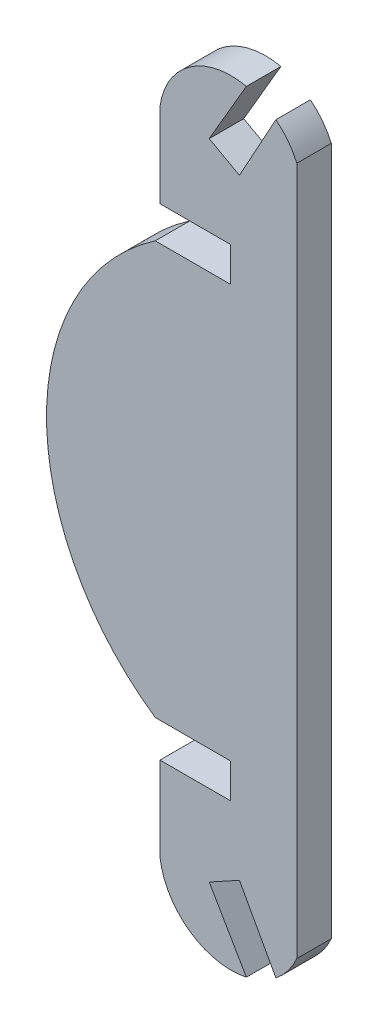
ISO-10303-21;
HEADER;
FILE_DESCRIPTION(('STEP AP214'),'2;1');
FILE_NAME('part.step','',(''),(''),'','','');
FILE_SCHEMA(('AUTOMOTIVE_DESIGN { 1 0 10303 214 1 1 1 1 }'));
ENDSEC;
DATA;
#1=APPLICATION_CONTEXT('core data for automotive mechanical design processes');
#2=APPLICATION_PROTOCOL_DEFINITION('international standard','automotive_design',2000,#1);
#3=PRODUCT_CONTEXT('',#1,'mechanical');
#4=PRODUCT('Part','Part','',(#3));
#5=PRODUCT_RELATED_PRODUCT_CATEGORY('part','',(#4));
#6=PRODUCT_DEFINITION_FORMATION('','',#4);
#7=PRODUCT_DEFINITION_CONTEXT('part definition',#1,'design');
#8=PRODUCT_DEFINITION('design','',#6,#7);
#9=PRODUCT_DEFINITION_SHAPE('','',#8);
#10=(LENGTH_UNIT() NAMED_UNIT(*) SI_UNIT(.MILLI.,.METRE.));
#11=(NAMED_UNIT(*) PLANE_ANGLE_UNIT() SI_UNIT($,.RADIAN.));
#12=(NAMED_UNIT(*) SI_UNIT($,.STERADIAN.) SOLID_ANGLE_UNIT());
#13=UNCERTAINTY_MEASURE_WITH_UNIT(LENGTH_MEASURE(1.E-05),#10,'distance_accuracy_value','');
#14=(GEOMETRIC_REPRESENTATION_CONTEXT(3) GLOBAL_UNCERTAINTY_ASSIGNED_CONTEXT((#13)) GLOBAL_UNIT_ASSIGNED_CONTEXT((#10,
#11,#12)) REPRESENTATION_CONTEXT('',''));
#15=CARTESIAN_POINT('',(0.,0.,0.));
#16=DIRECTION('',(0.,0.,1.));
#17=DIRECTION('',(1.,0.,0.));
#18=AXIS2_PLACEMENT_3D('',#15,#16,#17);
#19=CARTESIAN_POINT('',(194.442192630334,-119.572174415967,3.));
#20=DIRECTION('',(0.,0.,-1.));
#21=DIRECTION('',(-1.,0.,0.));
#22=AXIS2_PLACEMENT_3D('',#19,#20,#21);
#23=CYLINDRICAL_SURFACE('',#22,6.2400697461453);
#24=CARTESIAN_POINT('',(194.442192630334,-119.572174415967,0.));
#25=DIRECTION('',(0.,0.,1.));
#26=DIRECTION('',(-1.,0.,0.));
#27=AXIS2_PLACEMENT_3D('',#24,#25,#26);
#28=CIRCLE('',#27,6.2400697461453);
#29=CARTESIAN_POINT('',(198.339039248071,-124.445885206996,0.));
#30=VERTEX_POINT('',#29);
#31=CARTESIAN_POINT('',(200.158445725479,-122.07475727953,0.));
#32=VERTEX_POINT('',#31);
#33=EDGE_CURVE('E202',#30,#32,#28,.T.);
#34=ORIENTED_EDGE('',*,*,#33,.T.);
#35=DIRECTION('',(0.,0.,-1.));
#36=VECTOR('',#35,1.);
#37=CARTESIAN_POINT('',(200.158445725479,-122.07475727953,3.));
#38=LINE('',#37,#36);
#39=CARTESIAN_POINT('',(200.158445725479,-122.07475727953,3.));
#40=VERTEX_POINT('',#39);
#41=EDGE_CURVE('E11',#40,#32,#38,.T.);
#42=ORIENTED_EDGE('',*,*,#41,.F.);
#43=CARTESIAN_POINT('',(194.442192630334,-119.572174415967,3.));
#44=DIRECTION('',(0.,0.,1.));
#45=DIRECTION('',(-1.,0.,0.));
#46=AXIS2_PLACEMENT_3D('',#43,#44,#45);
#47=CIRCLE('',#46,6.2400697461453);
#48=CARTESIAN_POINT('',(198.339039248071,-124.445885206996,3.));
#49=VERTEX_POINT('',#48);
#50=EDGE_CURVE('E240',#49,#40,#47,.T.);
#51=ORIENTED_EDGE('',*,*,#50,.F.);
#52=DIRECTION('',(0.,0.,-1.));
#53=VECTOR('',#52,1.);
#54=CARTESIAN_POINT('',(198.339039248071,-124.445885206996,3.));
#55=LINE('',#54,#53);
#56=EDGE_CURVE('E198',#49,#30,#55,.T.);
#57=ORIENTED_EDGE('',*,*,#56,.T.);
#58=EDGE_LOOP('',(#34,#42,#51,#57));
#59=FACE_BOUND('',#58,.T.);
#60=ADVANCED_FACE('F34',(#59),#23,.T.);
#61=CARTESIAN_POINT('',(200.158445725479,-122.07475727953,3.));
#62=DIRECTION('',(-1.,0.,0.));
#63=DIRECTION('',(0.,0.,1.));
#64=AXIS2_PLACEMENT_3D('',#61,#62,#63);
#65=PLANE('',#64);
#66=DIRECTION('',(0.,1.,0.));
#67=VECTOR('',#66,1.);
#68=CARTESIAN_POINT('',(200.158445725479,-122.07475727953,0.));
#69=LINE('',#68,#67);
#70=CARTESIAN_POINT('',(200.158445725479,-62.1705737777062,0.));
#71=VERTEX_POINT('',#70);
#72=EDGE_CURVE('E205',#32,#71,#69,.T.);
#73=ORIENTED_EDGE('',*,*,#72,.T.);
#74=DIRECTION('',(0.,0.,-1.));
#75=VECTOR('',#74,1.);
#76=CARTESIAN_POINT('',(200.158445725479,-62.1705737777062,3.));
#77=LINE('',#76,#75);
#78=CARTESIAN_POINT('',(200.158445725479,-62.1705737777062,3.));
#79=VERTEX_POINT('',#78);
#80=EDGE_CURVE('E42',#79,#71,#77,.T.);
#81=ORIENTED_EDGE('',*,*,#80,.F.);
#82=DIRECTION('',(0.,1.,0.));
#83=VECTOR('',#82,1.);
#84=CARTESIAN_POINT('',(200.158445725479,-122.07475727953,3.));
#85=LINE('',#84,#83);
#86=EDGE_CURVE('E129',#40,#79,#85,.T.);
#87=ORIENTED_EDGE('',*,*,#86,.F.);
#88=ORIENTED_EDGE('',*,*,#41,.T.);
#89=EDGE_LOOP('',(#73,#81,#87,#88));
#90=FACE_BOUND('',#89,.T.);
#91=ADVANCED_FACE('F358',(#90),#65,.F.);
#92=CARTESIAN_POINT('',(194.442192630334,-64.6731566412699,3.));
#93=DIRECTION('',(0.,0.,-1.));
#94=DIRECTION('',(-1.,0.,0.));
#95=AXIS2_PLACEMENT_3D('',#92,#93,#94);
#96=CYLINDRICAL_SURFACE('',#95,6.24006974614529);
#97=CARTESIAN_POINT('',(194.442192630334,-64.6731566412699,0.));
#98=DIRECTION('',(0.,0.,1.));
#99=DIRECTION('',(1.,0.,0.));
#100=AXIS2_PLACEMENT_3D('',#97,#98,#99);
#101=CIRCLE('',#100,6.24006974614529);
#102=CARTESIAN_POINT('',(198.339039248071,-59.7994458502411,0.));
#103=VERTEX_POINT('',#102);
#104=EDGE_CURVE('E207',#71,#103,#101,.T.);
#105=ORIENTED_EDGE('',*,*,#104,.T.);
#106=DIRECTION('',(0.,0.,-1.));
#107=VECTOR('',#106,1.);
#108=CARTESIAN_POINT('',(198.339039248071,-59.7994458502411,3.));
#109=LINE('',#108,#107);
#110=CARTESIAN_POINT('',(198.339039248071,-59.7994458502411,3.));
#111=VERTEX_POINT('',#110);
#112=EDGE_CURVE('E283',#111,#103,#109,.T.);
#113=ORIENTED_EDGE('',*,*,#112,.F.);
#114=CARTESIAN_POINT('',(194.442192630334,-64.6731566412699,3.));
#115=DIRECTION('',(0.,0.,1.));
#116=DIRECTION('',(1.,0.,0.));
#117=AXIS2_PLACEMENT_3D('',#114,#115,#116);
#118=CIRCLE('',#117,6.24006974614529);
#119=EDGE_CURVE('E291',#79,#111,#118,.T.);
#120=ORIENTED_EDGE('',*,*,#119,.F.);
#121=ORIENTED_EDGE('',*,*,#80,.T.);
#122=EDGE_LOOP('',(#105,#113,#120,#121));
#123=FACE_BOUND('',#122,.T.);
#124=ADVANCED_FACE('F289',(#123),#96,.T.);
#125=CARTESIAN_POINT('',(195.167267959211,-65.5726655286183,3.));
#126=DIRECTION('',(0.876440149954587,-0.481510813531308,0.));
#127=DIRECTION('',(0.481510813531308,0.876440149954587,0.));
#128=AXIS2_PLACEMENT_3D('',#125,#126,#127);
#129=PLANE('',#128);
#130=DIRECTION('',(-0.481510813531308,-0.876440149954587,0.));
#131=VECTOR('',#130,1.);
#132=CARTESIAN_POINT('',(195.167267959211,-65.5726655286183,0.));
#133=LINE('',#132,#131);
#134=CARTESIAN_POINT('',(195.167267959211,-65.5726655286183,0.));
#135=VERTEX_POINT('',#134);
#136=EDGE_CURVE('E209',#103,#135,#133,.T.);
#137=ORIENTED_EDGE('',*,*,#136,.T.);
#138=DIRECTION('',(0.,0.,-1.));
#139=VECTOR('',#138,1.);
#140=CARTESIAN_POINT('',(195.167267959211,-65.5726655286183,3.));
#141=LINE('',#140,#139);
#142=CARTESIAN_POINT('',(195.167267959211,-65.5726655286183,3.));
#143=VERTEX_POINT('',#142);
#144=EDGE_CURVE('E280',#143,#135,#141,.T.);
#145=ORIENTED_EDGE('',*,*,#144,.F.);
#146=DIRECTION('',(-0.481510813531308,-0.876440149954587,0.));
#147=VECTOR('',#146,1.);
#148=CARTESIAN_POINT('',(195.167267959211,-65.5726655286183,3.));
#149=LINE('',#148,#147);
#150=EDGE_CURVE('E309',#111,#143,#149,.T.);
#151=ORIENTED_EDGE('',*,*,#150,.F.);
#152=ORIENTED_EDGE('',*,*,#112,.T.);
#153=EDGE_LOOP('',(#137,#145,#151,#152));
#154=FACE_BOUND('',#153,.T.);
#155=ADVANCED_FACE('F300',(#154),#129,.F.);
#156=CARTESIAN_POINT('',(192.537947509347,-64.1281330880244,3.));
#157=DIRECTION('',(-0.481510813531309,-0.876440149954586,0.));
#158=DIRECTION('',(0.876440149954586,-0.481510813531309,0.));
#159=AXIS2_PLACEMENT_3D('',#156,#157,#158);
#160=PLANE('',#159);
#161=DIRECTION('',(-0.876440149954586,0.481510813531309,0.));
#162=VECTOR('',#161,1.);
#163=CARTESIAN_POINT('',(192.537947509347,-64.1281330880244,0.));
#164=LINE('',#163,#162);
#165=CARTESIAN_POINT('',(192.537947509347,-64.1281330880244,0.));
#166=VERTEX_POINT('',#165);
#167=EDGE_CURVE('E211',#135,#166,#164,.T.);
#168=ORIENTED_EDGE('',*,*,#167,.T.);
#169=DIRECTION('',(0.,0.,-1.));
#170=VECTOR('',#169,1.);
#171=CARTESIAN_POINT('',(192.537947509347,-64.1281330880244,3.));
#172=LINE('',#171,#170);
#173=CARTESIAN_POINT('',(192.537947509347,-64.1281330880244,3.));
#174=VERTEX_POINT('',#173);
#175=EDGE_CURVE('E277',#174,#166,#172,.T.);
#176=ORIENTED_EDGE('',*,*,#175,.F.);
#177=DIRECTION('',(-0.876440149954586,0.481510813531309,0.));
#178=VECTOR('',#177,1.);
#179=CARTESIAN_POINT('',(192.537947509347,-64.1281330880244,3.));
#180=LINE('',#179,#178);
#181=EDGE_CURVE('E306',#143,#174,#180,.T.);
#182=ORIENTED_EDGE('',*,*,#181,.F.);
#183=ORIENTED_EDGE('',*,*,#144,.T.);
#184=EDGE_LOOP('',(#168,#176,#182,#183));
#185=FACE_BOUND('',#184,.T.);
#186=ADVANCED_FACE('F304',(#185),#160,.F.);
#187=CARTESIAN_POINT('',(192.537947509347,-64.1281330880244,3.));
#188=DIRECTION('',(-0.864082936072953,0.50334946070056,0.));
#189=DIRECTION('',(-0.50334946070056,-0.864082936072953,0.));
#190=AXIS2_PLACEMENT_3D('',#187,#188,#189);
#191=PLANE('',#190);
#192=DIRECTION('',(0.50334946070056,0.864082936072953,0.));
#193=VECTOR('',#192,1.);
#194=CARTESIAN_POINT('',(192.537947509347,-64.1281330880244,0.));
#195=LINE('',#194,#193);
#196=CARTESIAN_POINT('',(195.771956334189,-58.5764198970216,0.));
#197=VERTEX_POINT('',#196);
#198=EDGE_CURVE('E213',#166,#197,#195,.T.);
#199=ORIENTED_EDGE('',*,*,#198,.T.);
#200=DIRECTION('',(0.,0.,-1.));
#201=VECTOR('',#200,1.);
#202=CARTESIAN_POINT('',(195.771956334189,-58.5764198970216,3.));
#203=LINE('',#202,#201);
#204=CARTESIAN_POINT('',(195.771956334189,-58.5764198970216,3.));
#205=VERTEX_POINT('',#204);
#206=EDGE_CURVE('E274',#205,#197,#203,.T.);
#207=ORIENTED_EDGE('',*,*,#206,.F.);
#208=DIRECTION('',(0.50334946070056,0.864082936072953,0.));
#209=VECTOR('',#208,1.);
#210=CARTESIAN_POINT('',(192.537947509347,-64.1281330880244,3.));
#211=LINE('',#210,#209);
#212=EDGE_CURVE('E308',#174,#205,#211,.T.);
#213=ORIENTED_EDGE('',*,*,#212,.F.);
#214=ORIENTED_EDGE('',*,*,#175,.T.);
#215=EDGE_LOOP('',(#199,#207,#213,#214));
#216=FACE_BOUND('',#215,.T.);
#217=ADVANCED_FACE('F371',(#216),#191,.F.);
#218=CARTESIAN_POINT('',(194.442192630334,-64.6731566412699,3.));
#219=DIRECTION('',(0.,0.,-1.));
#220=DIRECTION('',(-1.,0.,0.));
#221=AXIS2_PLACEMENT_3D('',#218,#219,#220);
#222=CYLINDRICAL_SURFACE('',#221,6.24006974614526);
#223=CARTESIAN_POINT('',(194.442192630334,-64.6731566412699,0.));
#224=DIRECTION('',(0.,0.,1.));
#225=DIRECTION('',(1.,0.,0.));
#226=AXIS2_PLACEMENT_3D('',#223,#224,#225);
#227=CIRCLE('',#226,6.24006974614526);
#228=CARTESIAN_POINT('',(188.258458894633,-63.8365518823165,0.));
#229=VERTEX_POINT('',#228);
#230=EDGE_CURVE('E215',#197,#229,#227,.T.);
#231=ORIENTED_EDGE('',*,*,#230,.T.);
#232=DIRECTION('',(0.,0.,-1.));
#233=VECTOR('',#232,1.);
#234=CARTESIAN_POINT('',(188.258458894633,-63.8365518823165,3.));
#235=LINE('',#234,#233);
#236=CARTESIAN_POINT('',(188.258458894633,-63.8365518823165,3.));
#237=VERTEX_POINT('',#236);
#238=EDGE_CURVE('E271',#237,#229,#235,.T.);
#239=ORIENTED_EDGE('',*,*,#238,.F.);
#240=CARTESIAN_POINT('',(194.442192630334,-64.6731566412699,3.));
#241=DIRECTION('',(0.,0.,1.));
#242=DIRECTION('',(1.,0.,0.));
#243=AXIS2_PLACEMENT_3D('',#240,#241,#242);
#244=CIRCLE('',#243,6.24006974614526);
#245=EDGE_CURVE('E311',#205,#237,#244,.T.);
#246=ORIENTED_EDGE('',*,*,#245,.F.);
#247=ORIENTED_EDGE('',*,*,#206,.T.);
#248=EDGE_LOOP('',(#231,#239,#246,#247));
#249=FACE_BOUND('',#248,.T.);
#250=ADVANCED_FACE('F374',(#249),#222,.T.);
#251=CARTESIAN_POINT('',(188.258458894633,-71.1726655286183,3.));
#252=DIRECTION('',(1.,0.,0.));
#253=DIRECTION('',(0.,1.,0.));
#254=AXIS2_PLACEMENT_3D('',#251,#252,#253);
#255=PLANE('',#254);
#256=DIRECTION('',(0.,-1.,0.));
#257=VECTOR('',#256,1.);
#258=CARTESIAN_POINT('',(188.258458894633,-71.1726655286183,0.));
#259=LINE('',#258,#257);
#260=CARTESIAN_POINT('',(188.258458894633,-71.1726655286183,0.));
#261=VERTEX_POINT('',#260);
#262=EDGE_CURVE('E217',#229,#261,#259,.T.);
#263=ORIENTED_EDGE('',*,*,#262,.T.);
#264=DIRECTION('',(0.,0.,-1.));
#265=VECTOR('',#264,1.);
#266=CARTESIAN_POINT('',(188.258458894633,-71.1726655286183,3.));
#267=LINE('',#266,#265);
#268=CARTESIAN_POINT('',(188.258458894633,-71.1726655286183,3.));
#269=VERTEX_POINT('',#268);
#270=EDGE_CURVE('E268',#269,#261,#267,.T.);
#271=ORIENTED_EDGE('',*,*,#270,.F.);
#272=DIRECTION('',(0.,-1.,0.));
#273=VECTOR('',#272,1.);
#274=CARTESIAN_POINT('',(188.258458894633,-71.1726655286183,3.));
#275=LINE('',#274,#273);
#276=EDGE_CURVE('E317',#237,#269,#275,.T.);
#277=ORIENTED_EDGE('',*,*,#276,.F.);
#278=ORIENTED_EDGE('',*,*,#238,.T.);
#279=EDGE_LOOP('',(#263,#271,#277,#278));
#280=FACE_BOUND('',#279,.T.);
#281=ADVANCED_FACE('F378',(#280),#255,.F.);
#282=CARTESIAN_POINT('',(194.386873078623,-71.1726655286183,3.));
#283=DIRECTION('',(0.,1.,0.));
#284=DIRECTION('',(0.,0.,1.));
#285=AXIS2_PLACEMENT_3D('',#282,#283,#284);
#286=PLANE('',#285);
#287=DIRECTION('',(1.,0.,0.));
#288=VECTOR('',#287,1.);
#289=CARTESIAN_POINT('',(194.386873078623,-71.1726655286183,0.));
#290=LINE('',#289,#288);
#291=CARTESIAN_POINT('',(194.386873078623,-71.1726655286183,0.));
#292=VERTEX_POINT('',#291);
#293=EDGE_CURVE('E219',#261,#292,#290,.T.);
#294=ORIENTED_EDGE('',*,*,#293,.T.);
#295=DIRECTION('',(0.,0.,-1.));
#296=VECTOR('',#295,1.);
#297=CARTESIAN_POINT('',(194.386873078623,-71.1726655286183,3.));
#298=LINE('',#297,#296);
#299=CARTESIAN_POINT('',(194.386873078623,-71.1726655286183,3.));
#300=VERTEX_POINT('',#299);
#301=EDGE_CURVE('E265',#300,#292,#298,.T.);
#302=ORIENTED_EDGE('',*,*,#301,.F.);
#303=DIRECTION('',(1.,0.,0.));
#304=VECTOR('',#303,1.);
#305=CARTESIAN_POINT('',(194.386873078623,-71.1726655286183,3.));
#306=LINE('',#305,#304);
#307=EDGE_CURVE('E319',#269,#300,#306,.T.);
#308=ORIENTED_EDGE('',*,*,#307,.F.);
#309=ORIENTED_EDGE('',*,*,#270,.T.);
#310=EDGE_LOOP('',(#294,#302,#308,#309));
#311=FACE_BOUND('',#310,.T.);
#312=ADVANCED_FACE('F382',(#311),#286,.F.);
#313=CARTESIAN_POINT('',(194.386873078623,-71.1726655286183,3.));
#314=DIRECTION('',(1.,0.,0.));
#315=DIRECTION('',(0.,0.,-1.));
#316=AXIS2_PLACEMENT_3D('',#313,#314,#315);
#317=PLANE('',#316);
#318=DIRECTION('',(0.,-1.,0.));
#319=VECTOR('',#318,1.);
#320=CARTESIAN_POINT('',(194.386873078623,-71.1726655286183,0.));
#321=LINE('',#320,#319);
#322=CARTESIAN_POINT('',(194.386873078623,-74.1726655286183,0.));
#323=VERTEX_POINT('',#322);
#324=EDGE_CURVE('E221',#292,#323,#321,.T.);
#325=ORIENTED_EDGE('',*,*,#324,.T.);
#326=DIRECTION('',(0.,0.,-1.));
#327=VECTOR('',#326,1.);
#328=CARTESIAN_POINT('',(194.386873078623,-74.1726655286183,3.));
#329=LINE('',#328,#327);
#330=CARTESIAN_POINT('',(194.386873078623,-74.1726655286183,3.));
#331=VERTEX_POINT('',#330);
#332=EDGE_CURVE('E262',#331,#323,#329,.T.);
#333=ORIENTED_EDGE('',*,*,#332,.F.);
#334=DIRECTION('',(0.,-1.,0.));
#335=VECTOR('',#334,1.);
#336=CARTESIAN_POINT('',(194.386873078623,-71.1726655286183,3.));
#337=LINE('',#336,#335);
#338=EDGE_CURVE('E321',#300,#331,#337,.T.);
#339=ORIENTED_EDGE('',*,*,#338,.F.);
#340=ORIENTED_EDGE('',*,*,#301,.T.);
#341=EDGE_LOOP('',(#325,#333,#339,#340));
#342=FACE_BOUND('',#341,.T.);
#343=ADVANCED_FACE('F386',(#342),#317,.F.);
#344=CARTESIAN_POINT('',(194.386873078623,-74.1726655286183,3.));
#345=DIRECTION('',(0.,-1.,0.));
#346=DIRECTION('',(0.,0.,-1.));
#347=AXIS2_PLACEMENT_3D('',#344,#345,#346);
#348=PLANE('',#347);
#349=DIRECTION('',(-1.,0.,0.));
#350=VECTOR('',#349,1.);
#351=CARTESIAN_POINT('',(194.386873078623,-74.1726655286183,0.));
#352=LINE('',#351,#350);
#353=CARTESIAN_POINT('',(187.843216204322,-74.1726655286183,0.));
#354=VERTEX_POINT('',#353);
#355=EDGE_CURVE('E223',#323,#354,#352,.T.);
#356=ORIENTED_EDGE('',*,*,#355,.T.);
#357=DIRECTION('',(0.,0.,-1.));
#358=VECTOR('',#357,1.);
#359=CARTESIAN_POINT('',(187.843216204322,-74.1726655286183,3.));
#360=LINE('',#359,#358);
#361=CARTESIAN_POINT('',(187.843216204322,-74.1726655286183,3.));
#362=VERTEX_POINT('',#361);
#363=EDGE_CURVE('E259',#362,#354,#360,.T.);
#364=ORIENTED_EDGE('',*,*,#363,.F.);
#365=DIRECTION('',(-1.,0.,0.));
#366=VECTOR('',#365,1.);
#367=CARTESIAN_POINT('',(194.386873078623,-74.1726655286183,3.));
#368=LINE('',#367,#366);
#369=EDGE_CURVE('E323',#331,#362,#368,.T.);
#370=ORIENTED_EDGE('',*,*,#369,.F.);
#371=ORIENTED_EDGE('',*,*,#332,.T.);
#372=EDGE_LOOP('',(#356,#364,#370,#371));
#373=FACE_BOUND('',#372,.T.);
#374=ADVANCED_FACE('F390',(#373),#348,.F.);
#375=CARTESIAN_POINT('',(200.158445725479,-92.1226655286183,3.));
#376=DIRECTION('',(0.,0.,-1.));
#377=DIRECTION('',(-1.,0.,0.));
#378=AXIS2_PLACEMENT_3D('',#375,#376,#377);
#379=CYLINDRICAL_SURFACE('',#378,21.7684950825447);
#380=CARTESIAN_POINT('',(200.158445725479,-92.1226655286183,0.));
#381=DIRECTION('',(0.,0.,1.));
#382=DIRECTION('',(1.,0.,0.));
#383=AXIS2_PLACEMENT_3D('',#380,#381,#382);
#384=CIRCLE('',#383,21.7684950825447);
#385=CARTESIAN_POINT('',(187.843216204322,-110.072665528618,0.));
#386=VERTEX_POINT('',#385);
#387=EDGE_CURVE('E225',#354,#386,#384,.T.);
#388=ORIENTED_EDGE('',*,*,#387,.T.);
#389=DIRECTION('',(0.,0.,-1.));
#390=VECTOR('',#389,1.);
#391=CARTESIAN_POINT('',(187.843216204322,-110.072665528618,3.));
#392=LINE('',#391,#390);
#393=CARTESIAN_POINT('',(187.843216204322,-110.072665528618,3.));
#394=VERTEX_POINT('',#393);
#395=EDGE_CURVE('E256',#394,#386,#392,.T.);
#396=ORIENTED_EDGE('',*,*,#395,.F.);
#397=CARTESIAN_POINT('',(200.158445725479,-92.1226655286183,3.));
#398=DIRECTION('',(0.,0.,1.));
#399=DIRECTION('',(1.,0.,0.));
#400=AXIS2_PLACEMENT_3D('',#397,#398,#399);
#401=CIRCLE('',#400,21.7684950825447);
#402=EDGE_CURVE('E325',#362,#394,#401,.T.);
#403=ORIENTED_EDGE('',*,*,#402,.F.);
#404=ORIENTED_EDGE('',*,*,#363,.T.);
#405=EDGE_LOOP('',(#388,#396,#403,#404));
#406=FACE_BOUND('',#405,.T.);
#407=ADVANCED_FACE('F394',(#406),#379,.T.);
#408=CARTESIAN_POINT('',(194.386873078623,-110.072665528618,3.));
#409=DIRECTION('',(0.,1.,0.));
#410=DIRECTION('',(0.,0.,1.));
#411=AXIS2_PLACEMENT_3D('',#408,#409,#410);
#412=PLANE('',#411);
#413=DIRECTION('',(1.,0.,0.));
#414=VECTOR('',#413,1.);
#415=CARTESIAN_POINT('',(194.386873078623,-110.072665528618,0.));
#416=LINE('',#415,#414);
#417=CARTESIAN_POINT('',(194.386873078623,-110.072665528618,0.));
#418=VERTEX_POINT('',#417);
#419=EDGE_CURVE('E227',#386,#418,#416,.T.);
#420=ORIENTED_EDGE('',*,*,#419,.T.);
#421=DIRECTION('',(0.,0.,-1.));
#422=VECTOR('',#421,1.);
#423=CARTESIAN_POINT('',(194.386873078623,-110.072665528618,3.));
#424=LINE('',#423,#422);
#425=CARTESIAN_POINT('',(194.386873078623,-110.072665528618,3.));
#426=VERTEX_POINT('',#425);
#427=EDGE_CURVE('E253',#426,#418,#424,.T.);
#428=ORIENTED_EDGE('',*,*,#427,.F.);
#429=DIRECTION('',(1.,0.,0.));
#430=VECTOR('',#429,1.);
#431=CARTESIAN_POINT('',(194.386873078623,-110.072665528618,3.));
#432=LINE('',#431,#430);
#433=EDGE_CURVE('E327',#394,#426,#432,.T.);
#434=ORIENTED_EDGE('',*,*,#433,.F.);
#435=ORIENTED_EDGE('',*,*,#395,.T.);
#436=EDGE_LOOP('',(#420,#428,#434,#435));
#437=FACE_BOUND('',#436,.T.);
#438=ADVANCED_FACE('F398',(#437),#412,.F.);
#439=CARTESIAN_POINT('',(194.386873078623,-113.072665528618,3.));
#440=DIRECTION('',(1.,0.,0.));
#441=DIRECTION('',(0.,0.,-1.));
#442=AXIS2_PLACEMENT_3D('',#439,#440,#441);
#443=PLANE('',#442);
#444=DIRECTION('',(0.,-1.,0.));
#445=VECTOR('',#444,1.);
#446=CARTESIAN_POINT('',(194.386873078623,-113.072665528618,0.));
#447=LINE('',#446,#445);
#448=CARTESIAN_POINT('',(194.386873078623,-113.072665528618,0.));
#449=VERTEX_POINT('',#448);
#450=EDGE_CURVE('E229',#418,#449,#447,.T.);
#451=ORIENTED_EDGE('',*,*,#450,.T.);
#452=DIRECTION('',(0.,0.,-1.));
#453=VECTOR('',#452,1.);
#454=CARTESIAN_POINT('',(194.386873078623,-113.072665528618,3.));
#455=LINE('',#454,#453);
#456=CARTESIAN_POINT('',(194.386873078623,-113.072665528618,3.));
#457=VERTEX_POINT('',#456);
#458=EDGE_CURVE('E250',#457,#449,#455,.T.);
#459=ORIENTED_EDGE('',*,*,#458,.F.);
#460=DIRECTION('',(0.,-1.,0.));
#461=VECTOR('',#460,1.);
#462=CARTESIAN_POINT('',(194.386873078623,-113.072665528618,3.));
#463=LINE('',#462,#461);
#464=EDGE_CURVE('E329',#426,#457,#463,.T.);
#465=ORIENTED_EDGE('',*,*,#464,.F.);
#466=ORIENTED_EDGE('',*,*,#427,.T.);
#467=EDGE_LOOP('',(#451,#459,#465,#466));
#468=FACE_BOUND('',#467,.T.);
#469=ADVANCED_FACE('F402',(#468),#443,.F.);
#470=CARTESIAN_POINT('',(194.386873078623,-113.072665528618,3.));
#471=DIRECTION('',(0.,-1.,0.));
#472=DIRECTION('',(0.,0.,-1.));
#473=AXIS2_PLACEMENT_3D('',#470,#471,#472);
#474=PLANE('',#473);
#475=DIRECTION('',(-1.,0.,0.));
#476=VECTOR('',#475,1.);
#477=CARTESIAN_POINT('',(194.386873078623,-113.072665528618,0.));
#478=LINE('',#477,#476);
#479=CARTESIAN_POINT('',(188.258458894633,-113.072665528618,0.));
#480=VERTEX_POINT('',#479);
#481=EDGE_CURVE('E231',#449,#480,#478,.T.);
#482=ORIENTED_EDGE('',*,*,#481,.T.);
#483=DIRECTION('',(0.,0.,-1.));
#484=VECTOR('',#483,1.);
#485=CARTESIAN_POINT('',(188.258458894633,-113.072665528618,3.));
#486=LINE('',#485,#484);
#487=CARTESIAN_POINT('',(188.258458894633,-113.072665528618,3.));
#488=VERTEX_POINT('',#487);
#489=EDGE_CURVE('E247',#488,#480,#486,.T.);
#490=ORIENTED_EDGE('',*,*,#489,.F.);
#491=DIRECTION('',(-1.,0.,0.));
#492=VECTOR('',#491,1.);
#493=CARTESIAN_POINT('',(194.386873078623,-113.072665528618,3.));
#494=LINE('',#493,#492);
#495=EDGE_CURVE('E331',#457,#488,#494,.T.);
#496=ORIENTED_EDGE('',*,*,#495,.F.);
#497=ORIENTED_EDGE('',*,*,#458,.T.);
#498=EDGE_LOOP('',(#482,#490,#496,#497));
#499=FACE_BOUND('',#498,.T.);
#500=ADVANCED_FACE('F406',(#499),#474,.F.);
#501=CARTESIAN_POINT('',(188.258458894633,-113.072665528618,3.));
#502=DIRECTION('',(1.,0.,0.));
#503=DIRECTION('',(0.,1.,0.));
#504=AXIS2_PLACEMENT_3D('',#501,#502,#503);
#505=PLANE('',#504);
#506=DIRECTION('',(0.,-1.,0.));
#507=VECTOR('',#506,1.);
#508=CARTESIAN_POINT('',(188.258458894633,-113.072665528618,0.));
#509=LINE('',#508,#507);
#510=CARTESIAN_POINT('',(188.258458894633,-120.40877917492,0.));
#511=VERTEX_POINT('',#510);
#512=EDGE_CURVE('E233',#480,#511,#509,.T.);
#513=ORIENTED_EDGE('',*,*,#512,.T.);
#514=DIRECTION('',(0.,0.,-1.));
#515=VECTOR('',#514,1.);
#516=CARTESIAN_POINT('',(188.258458894633,-120.40877917492,3.));
#517=LINE('',#516,#515);
#518=CARTESIAN_POINT('',(188.258458894633,-120.40877917492,3.));
#519=VERTEX_POINT('',#518);
#520=EDGE_CURVE('E244',#519,#511,#517,.T.);
#521=ORIENTED_EDGE('',*,*,#520,.F.);
#522=DIRECTION('',(0.,-1.,0.));
#523=VECTOR('',#522,1.);
#524=CARTESIAN_POINT('',(188.258458894633,-113.072665528618,3.));
#525=LINE('',#524,#523);
#526=EDGE_CURVE('E333',#488,#519,#525,.T.);
#527=ORIENTED_EDGE('',*,*,#526,.F.);
#528=ORIENTED_EDGE('',*,*,#489,.T.);
#529=EDGE_LOOP('',(#513,#521,#527,#528));
#530=FACE_BOUND('',#529,.T.);
#531=ADVANCED_FACE('F339',(#530),#505,.F.);
#532=CARTESIAN_POINT('',(194.442192630334,-119.572174415967,3.));
#533=DIRECTION('',(0.,0.,-1.));
#534=DIRECTION('',(-1.,0.,0.));
#535=AXIS2_PLACEMENT_3D('',#532,#533,#534);
#536=CYLINDRICAL_SURFACE('',#535,6.24006974614526);
#537=CARTESIAN_POINT('',(194.442192630334,-119.572174415967,0.));
#538=DIRECTION('',(0.,0.,1.));
#539=DIRECTION('',(-1.,0.,0.));
#540=AXIS2_PLACEMENT_3D('',#537,#538,#539);
#541=CIRCLE('',#540,6.24006974614526);
#542=CARTESIAN_POINT('',(195.771956334189,-125.668911160215,0.));
#543=VERTEX_POINT('',#542);
#544=EDGE_CURVE('E235',#511,#543,#541,.T.);
#545=ORIENTED_EDGE('',*,*,#544,.T.);
#546=DIRECTION('',(0.,0.,-1.));
#547=VECTOR('',#546,1.);
#548=CARTESIAN_POINT('',(195.771956334189,-125.668911160215,3.));
#549=LINE('',#548,#547);
#550=CARTESIAN_POINT('',(195.771956334189,-125.668911160215,3.));
#551=VERTEX_POINT('',#550);
#552=EDGE_CURVE('E193',#551,#543,#549,.T.);
#553=ORIENTED_EDGE('',*,*,#552,.F.);
#554=CARTESIAN_POINT('',(194.442192630334,-119.572174415967,3.));
#555=DIRECTION('',(0.,0.,1.));
#556=DIRECTION('',(-1.,0.,0.));
#557=AXIS2_PLACEMENT_3D('',#554,#555,#556);
#558=CIRCLE('',#557,6.24006974614526);
#559=EDGE_CURVE('E184',#519,#551,#558,.T.);
#560=ORIENTED_EDGE('',*,*,#559,.F.);
#561=ORIENTED_EDGE('',*,*,#520,.T.);
#562=EDGE_LOOP('',(#545,#553,#560,#561));
#563=FACE_BOUND('',#562,.T.);
#564=ADVANCED_FACE('F343',(#563),#536,.T.);
#565=CARTESIAN_POINT('',(192.537947509347,-120.117197969212,3.));
#566=DIRECTION('',(-0.864082936072953,-0.503349460700559,0.));
#567=DIRECTION('',(0.503349460700559,-0.864082936072954,0.));
#568=AXIS2_PLACEMENT_3D('',#565,#566,#567);
#569=PLANE('',#568);
#570=DIRECTION('',(-0.503349460700559,0.864082936072954,0.));
#571=VECTOR('',#570,1.);
#572=CARTESIAN_POINT('',(192.537947509347,-120.117197969212,0.));
#573=LINE('',#572,#571);
#574=CARTESIAN_POINT('',(192.537947509347,-120.117197969212,0.));
#575=VERTEX_POINT('',#574);
#576=EDGE_CURVE('E192',#543,#575,#573,.T.);
#577=ORIENTED_EDGE('',*,*,#576,.T.);
#578=DIRECTION('',(0.,0.,-1.));
#579=VECTOR('',#578,1.);
#580=CARTESIAN_POINT('',(192.537947509347,-120.117197969212,3.));
#581=LINE('',#580,#579);
#582=CARTESIAN_POINT('',(192.537947509347,-120.117197969212,3.));
#583=VERTEX_POINT('',#582);
#584=EDGE_CURVE('E189',#583,#575,#581,.T.);
#585=ORIENTED_EDGE('',*,*,#584,.F.);
#586=DIRECTION('',(-0.503349460700559,0.864082936072954,0.));
#587=VECTOR('',#586,1.);
#588=CARTESIAN_POINT('',(192.537947509347,-120.117197969212,3.));
#589=LINE('',#588,#587);
#590=EDGE_CURVE('E178',#551,#583,#589,.T.);
#591=ORIENTED_EDGE('',*,*,#590,.F.);
#592=ORIENTED_EDGE('',*,*,#552,.T.);
#593=EDGE_LOOP('',(#577,#585,#591,#592));
#594=FACE_BOUND('',#593,.T.);
#595=ADVANCED_FACE('F190',(#594),#569,.F.);
#596=CARTESIAN_POINT('',(192.537947509347,-120.117197969212,3.));
#597=DIRECTION('',(-0.481510813531309,0.876440149954586,0.));
#598=DIRECTION('',(-0.876440149954586,-0.481510813531309,0.));
#599=AXIS2_PLACEMENT_3D('',#596,#597,#598);
#600=PLANE('',#599);
#601=DIRECTION('',(0.876440149954586,0.481510813531309,0.));
#602=VECTOR('',#601,1.);
#603=CARTESIAN_POINT('',(192.537947509347,-120.117197969212,0.));
#604=LINE('',#603,#602);
#605=CARTESIAN_POINT('',(195.167267959211,-118.672665528618,0.));
#606=VERTEX_POINT('',#605);
#607=EDGE_CURVE('E115',#575,#606,#604,.T.);
#608=ORIENTED_EDGE('',*,*,#607,.T.);
#609=DIRECTION('',(0.,0.,-1.));
#610=VECTOR('',#609,1.);
#611=CARTESIAN_POINT('',(195.167267959211,-118.672665528618,3.));
#612=LINE('',#611,#610);
#613=CARTESIAN_POINT('',(195.167267959211,-118.672665528618,3.));
#614=VERTEX_POINT('',#613);
#615=EDGE_CURVE('E194',#614,#606,#612,.T.);
#616=ORIENTED_EDGE('',*,*,#615,.F.);
#617=DIRECTION('',(0.876440149954586,0.481510813531309,0.));
#618=VECTOR('',#617,1.);
#619=CARTESIAN_POINT('',(192.537947509347,-120.117197969212,3.));
#620=LINE('',#619,#618);
#621=EDGE_CURVE('E182',#583,#614,#620,.T.);
#622=ORIENTED_EDGE('',*,*,#621,.F.);
#623=ORIENTED_EDGE('',*,*,#584,.T.);
#624=EDGE_LOOP('',(#608,#616,#622,#623));
#625=FACE_BOUND('',#624,.T.);
#626=ADVANCED_FACE('F196',(#625),#600,.F.);
#627=CARTESIAN_POINT('',(195.167267959211,-118.672665528618,3.));
#628=DIRECTION('',(0.876440149954587,0.481510813531307,0.));
#629=DIRECTION('',(-0.481510813531307,0.876440149954587,0.));
#630=AXIS2_PLACEMENT_3D('',#627,#628,#629);
#631=PLANE('',#630);
#632=DIRECTION('',(0.481510813531307,-0.876440149954587,0.));
#633=VECTOR('',#632,1.);
#634=CARTESIAN_POINT('',(195.167267959211,-118.672665528618,0.));
#635=LINE('',#634,#633);
#636=EDGE_CURVE('E121',#606,#30,#635,.T.);
#637=ORIENTED_EDGE('',*,*,#636,.T.);
#638=ORIENTED_EDGE('',*,*,#56,.F.);
#639=DIRECTION('',(0.481510813531307,-0.876440149954587,0.));
#640=VECTOR('',#639,1.);
#641=CARTESIAN_POINT('',(195.167267959211,-118.672665528618,3.));
#642=LINE('',#641,#640);
#643=EDGE_CURVE('E50',#614,#49,#642,.T.);
#644=ORIENTED_EDGE('',*,*,#643,.F.);
#645=ORIENTED_EDGE('',*,*,#615,.T.);
#646=EDGE_LOOP('',(#637,#638,#644,#645));
#647=FACE_BOUND('',#646,.T.);
#648=ADVANCED_FACE('F347',(#647),#631,.F.);
#649=CARTESIAN_POINT('',(194.442192630334,-119.572174415967,3.));
#650=DIRECTION('',(0.,0.,-1.));
#651=DIRECTION('',(-1.,0.,0.));
#652=AXIS2_PLACEMENT_3D('',#649,#650,#651);
#653=PLANE('',#652);
#654=ORIENTED_EDGE('',*,*,#50,.T.);
#655=ORIENTED_EDGE('',*,*,#86,.T.);
#656=ORIENTED_EDGE('',*,*,#119,.T.);
#657=ORIENTED_EDGE('',*,*,#150,.T.);
#658=ORIENTED_EDGE('',*,*,#181,.T.);
#659=ORIENTED_EDGE('',*,*,#212,.T.);
#660=ORIENTED_EDGE('',*,*,#245,.T.);
#661=ORIENTED_EDGE('',*,*,#276,.T.);
#662=ORIENTED_EDGE('',*,*,#307,.T.);
#663=ORIENTED_EDGE('',*,*,#338,.T.);
#664=ORIENTED_EDGE('',*,*,#369,.T.);
#665=ORIENTED_EDGE('',*,*,#402,.T.);
#666=ORIENTED_EDGE('',*,*,#433,.T.);
#667=ORIENTED_EDGE('',*,*,#464,.T.);
#668=ORIENTED_EDGE('',*,*,#495,.T.);
#669=ORIENTED_EDGE('',*,*,#526,.T.);
#670=ORIENTED_EDGE('',*,*,#559,.T.);
#671=ORIENTED_EDGE('',*,*,#590,.T.);
#672=ORIENTED_EDGE('',*,*,#621,.T.);
#673=ORIENTED_EDGE('',*,*,#643,.T.);
#674=EDGE_LOOP('',(#654,#655,#656,#657,#658,#659,#660,#661,#662,#663,#664,#665,#666,#667,#668,
#669,#670,#671,#672,#673));
#675=FACE_BOUND('',#674,.T.);
#676=ADVANCED_FACE('F180',(#675),#653,.F.);
#677=CARTESIAN_POINT('',(194.442192630334,-119.572174415967,0.));
#678=DIRECTION('',(0.,0.,-1.));
#679=DIRECTION('',(-1.,0.,0.));
#680=AXIS2_PLACEMENT_3D('',#677,#678,#679);
#681=PLANE('',#680);
#682=ORIENTED_EDGE('',*,*,#33,.F.);
#683=ORIENTED_EDGE('',*,*,#636,.F.);
#684=ORIENTED_EDGE('',*,*,#607,.F.);
#685=ORIENTED_EDGE('',*,*,#576,.F.);
#686=ORIENTED_EDGE('',*,*,#544,.F.);
#687=ORIENTED_EDGE('',*,*,#512,.F.);
#688=ORIENTED_EDGE('',*,*,#481,.F.);
#689=ORIENTED_EDGE('',*,*,#450,.F.);
#690=ORIENTED_EDGE('',*,*,#419,.F.);
#691=ORIENTED_EDGE('',*,*,#387,.F.);
#692=ORIENTED_EDGE('',*,*,#355,.F.);
#693=ORIENTED_EDGE('',*,*,#324,.F.);
#694=ORIENTED_EDGE('',*,*,#293,.F.);
#695=ORIENTED_EDGE('',*,*,#262,.F.);
#696=ORIENTED_EDGE('',*,*,#230,.F.);
#697=ORIENTED_EDGE('',*,*,#198,.F.);
#698=ORIENTED_EDGE('',*,*,#167,.F.);
#699=ORIENTED_EDGE('',*,*,#136,.F.);
#700=ORIENTED_EDGE('',*,*,#104,.F.);
#701=ORIENTED_EDGE('',*,*,#72,.F.);
#702=EDGE_LOOP('',(#682,#683,#684,#685,#686,#687,#688,#689,#690,#691,#692,#693,#694,#695,#696,
#697,#698,#699,#700,#701));
#703=FACE_BOUND('',#702,.T.);
#704=ADVANCED_FACE('F295',(#703),#681,.T.);
#705=CLOSED_SHELL('',(#60,#91,#124,#155,#186,#217,#250,#281,#312,#343,#374,#407,#438,#469,#500,
#531,#564,#595,#626,#648,#676,#704));
#706=MANIFOLD_SOLID_BREP('B2',#705);
#707=ADVANCED_BREP_SHAPE_REPRESENTATION('',(#18,#706),#14);
#708=SHAPE_DEFINITION_REPRESENTATION(#9,#707);
ENDSEC;
END-ISO-10303-21;
